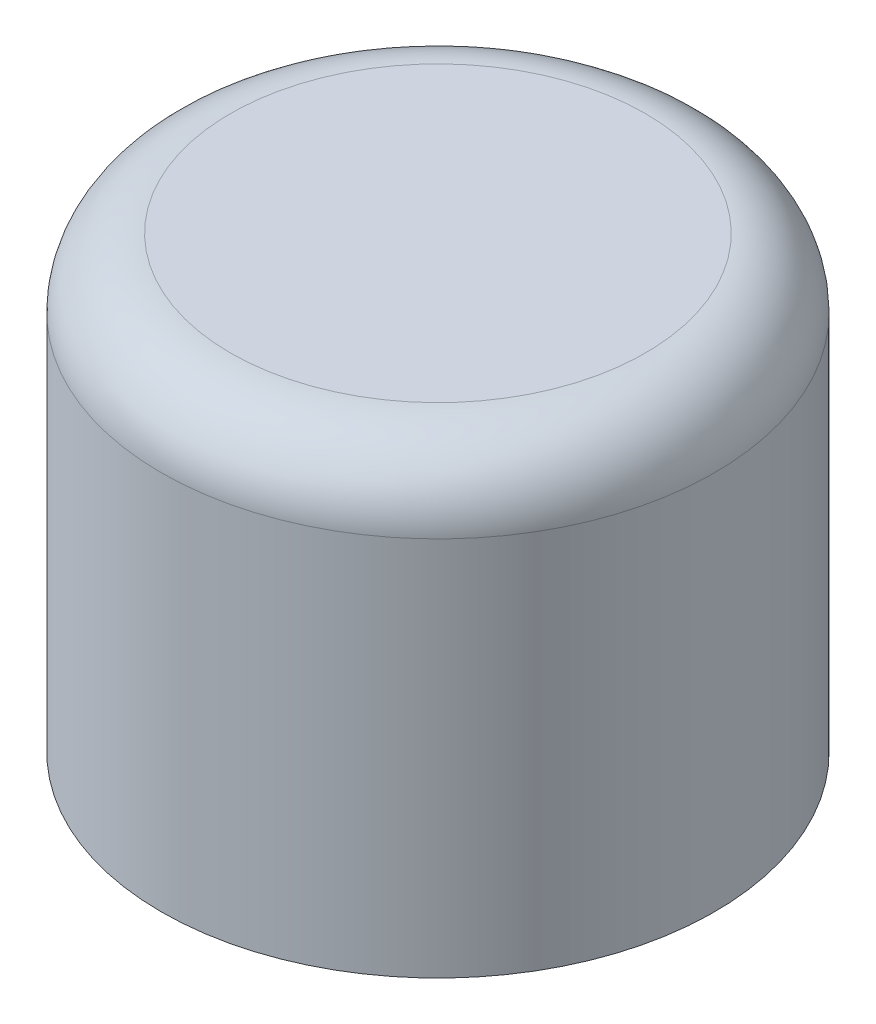
ISO-10303-21;
HEADER;
FILE_DESCRIPTION(('STEP AP214'),'2;1');
FILE_NAME('part.step','',(''),(''),'','','');
FILE_SCHEMA(('AUTOMOTIVE_DESIGN { 1 0 10303 214 1 1 1 1 }'));
ENDSEC;
DATA;
#1=APPLICATION_CONTEXT('core data for automotive mechanical design processes');
#2=APPLICATION_PROTOCOL_DEFINITION('international standard','automotive_design',2000,#1);
#3=PRODUCT_CONTEXT('',#1,'mechanical');
#4=PRODUCT('Part','Part','',(#3));
#5=PRODUCT_RELATED_PRODUCT_CATEGORY('part','',(#4));
#6=PRODUCT_DEFINITION_FORMATION('','',#4);
#7=PRODUCT_DEFINITION_CONTEXT('part definition',#1,'design');
#8=PRODUCT_DEFINITION('design','',#6,#7);
#9=PRODUCT_DEFINITION_SHAPE('','',#8);
#10=(LENGTH_UNIT() NAMED_UNIT(*) SI_UNIT(.MILLI.,.METRE.));
#11=(NAMED_UNIT(*) PLANE_ANGLE_UNIT() SI_UNIT($,.RADIAN.));
#12=(NAMED_UNIT(*) SI_UNIT($,.STERADIAN.) SOLID_ANGLE_UNIT());
#13=UNCERTAINTY_MEASURE_WITH_UNIT(LENGTH_MEASURE(1.E-05),#10,'distance_accuracy_value','');
#14=(GEOMETRIC_REPRESENTATION_CONTEXT(3) GLOBAL_UNCERTAINTY_ASSIGNED_CONTEXT((#13)) GLOBAL_UNIT_ASSIGNED_CONTEXT((#10,
#11,#12)) REPRESENTATION_CONTEXT('',''));
#15=CARTESIAN_POINT('',(0.,0.,0.));
#16=DIRECTION('',(0.,0.,1.));
#17=DIRECTION('',(1.,0.,0.));
#18=AXIS2_PLACEMENT_3D('',#15,#16,#17);
#19=CARTESIAN_POINT('',(0.,0.,0.));
#20=DIRECTION('',(0.,1.,0.));
#21=DIRECTION('',(0.,0.,1.));
#22=AXIS2_PLACEMENT_3D('',#19,#20,#21);
#23=PLANE('',#22);
#24=CARTESIAN_POINT('',(0.,0.,0.));
#25=DIRECTION('',(0.,1.,0.));
#26=DIRECTION('',(0.,0.,1.));
#27=AXIS2_PLACEMENT_3D('',#24,#25,#26);
#28=CIRCLE('',#27,10.16);
#29=CARTESIAN_POINT('',(0.,0.,10.16));
#30=VERTEX_POINT('',#29);
#31=EDGE_CURVE('E43',#30,#30,#28,.T.);
#32=ORIENTED_EDGE('',*,*,#31,.F.);
#33=EDGE_LOOP('',(#32));
#34=FACE_BOUND('',#33,.T.);
#35=CARTESIAN_POINT('',(0.,0.,0.));
#36=DIRECTION('',(0.,1.,0.));
#37=DIRECTION('',(0.,0.,1.));
#38=AXIS2_PLACEMENT_3D('',#35,#36,#37);
#39=CIRCLE('',#38,7.62);
#40=CARTESIAN_POINT('',(0.,0.,7.62));
#41=VERTEX_POINT('',#40);
#42=EDGE_CURVE('E50',#41,#41,#39,.T.);
#43=ORIENTED_EDGE('',*,*,#42,.T.);
#44=EDGE_LOOP('',(#43));
#45=FACE_BOUND('',#44,.T.);
#46=ADVANCED_FACE('F32',(#34,#45),#23,.F.);
#47=CARTESIAN_POINT('',(0.,16.51,0.));
#48=DIRECTION('',(0.,-1.,0.));
#49=DIRECTION('',(0.,0.,-1.));
#50=AXIS2_PLACEMENT_3D('',#47,#48,#49);
#51=CYLINDRICAL_SURFACE('',#50,10.16);
#52=CARTESIAN_POINT('',(0.,13.97,0.));
#53=DIRECTION('',(0.,1.,0.));
#54=DIRECTION('',(0.,0.,1.));
#55=AXIS2_PLACEMENT_3D('',#52,#53,#54);
#56=CIRCLE('',#55,10.16);
#57=CARTESIAN_POINT('',(0.,13.97,10.16));
#58=VERTEX_POINT('',#57);
#59=EDGE_CURVE('E10',#58,#58,#56,.F.);
#60=ORIENTED_EDGE('',*,*,#59,.T.);
#61=EDGE_LOOP('',(#60));
#62=FACE_BOUND('',#61,.T.);
#63=ORIENTED_EDGE('',*,*,#31,.T.);
#64=EDGE_LOOP('',(#63));
#65=FACE_BOUND('',#64,.T.);
#66=ADVANCED_FACE('F70',(#62,#65),#51,.T.);
#67=CARTESIAN_POINT('',(0.,16.51,0.));
#68=DIRECTION('',(0.,1.,0.));
#69=DIRECTION('',(0.,0.,1.));
#70=AXIS2_PLACEMENT_3D('',#67,#68,#69);
#71=PLANE('',#70);
#72=CARTESIAN_POINT('',(0.,16.51,0.));
#73=DIRECTION('',(0.,1.,0.));
#74=DIRECTION('',(0.,0.,1.));
#75=AXIS2_PLACEMENT_3D('',#72,#73,#74);
#76=CIRCLE('',#75,7.62);
#77=CARTESIAN_POINT('',(0.,16.51,7.62));
#78=VERTEX_POINT('',#77);
#79=EDGE_CURVE('E39',#78,#78,#76,.T.);
#80=ORIENTED_EDGE('',*,*,#79,.T.);
#81=EDGE_LOOP('',(#80));
#82=FACE_BOUND('',#81,.T.);
#83=ADVANCED_FACE('F67',(#82),#71,.T.);
#84=CARTESIAN_POINT('',(0.,12.7,0.));
#85=DIRECTION('',(0.,-1.,0.));
#86=DIRECTION('',(0.,0.,-1.));
#87=AXIS2_PLACEMENT_3D('',#84,#85,#86);
#88=CYLINDRICAL_SURFACE('',#87,7.62);
#89=CARTESIAN_POINT('',(0.,12.7,0.));
#90=DIRECTION('',(0.,1.,0.));
#91=DIRECTION('',(0.,0.,1.));
#92=AXIS2_PLACEMENT_3D('',#89,#90,#91);
#93=CIRCLE('',#92,7.62);
#94=CARTESIAN_POINT('',(0.,12.7,7.62));
#95=VERTEX_POINT('',#94);
#96=EDGE_CURVE('E47',#95,#95,#93,.T.);
#97=ORIENTED_EDGE('',*,*,#96,.T.);
#98=EDGE_LOOP('',(#97));
#99=FACE_BOUND('',#98,.T.);
#100=ORIENTED_EDGE('',*,*,#42,.F.);
#101=EDGE_LOOP('',(#100));
#102=FACE_BOUND('',#101,.T.);
#103=ADVANCED_FACE('F56',(#99,#102),#88,.F.);
#104=CARTESIAN_POINT('',(0.,12.7,0.));
#105=DIRECTION('',(0.,1.,0.));
#106=DIRECTION('',(0.,0.,1.));
#107=AXIS2_PLACEMENT_3D('',#104,#105,#106);
#108=PLANE('',#107);
#109=ORIENTED_EDGE('',*,*,#96,.F.);
#110=EDGE_LOOP('',(#109));
#111=FACE_BOUND('',#110,.T.);
#112=ADVANCED_FACE('F59',(#111),#108,.F.);
#113=CARTESIAN_POINT('',(0.,13.97,0.));
#114=DIRECTION('',(0.,1.,0.));
#115=DIRECTION('',(0.,0.,1.));
#116=AXIS2_PLACEMENT_3D('',#113,#114,#115);
#117=TOROIDAL_SURFACE('',#116,7.62,2.54);
#118=ORIENTED_EDGE('',*,*,#59,.F.);
#119=EDGE_LOOP('',(#118));
#120=FACE_BOUND('',#119,.T.);
#121=ORIENTED_EDGE('',*,*,#79,.F.);
#122=EDGE_LOOP('',(#121));
#123=FACE_BOUND('',#122,.T.);
#124=ADVANCED_FACE('F34',(#120,#123),#117,.T.);
#125=CLOSED_SHELL('',(#46,#66,#83,#103,#112,#124));
#126=MANIFOLD_SOLID_BREP('B2',#125);
#127=ADVANCED_BREP_SHAPE_REPRESENTATION('',(#18,#126),#14);
#128=SHAPE_DEFINITION_REPRESENTATION(#9,#127);
ENDSEC;
END-ISO-10303-21;
